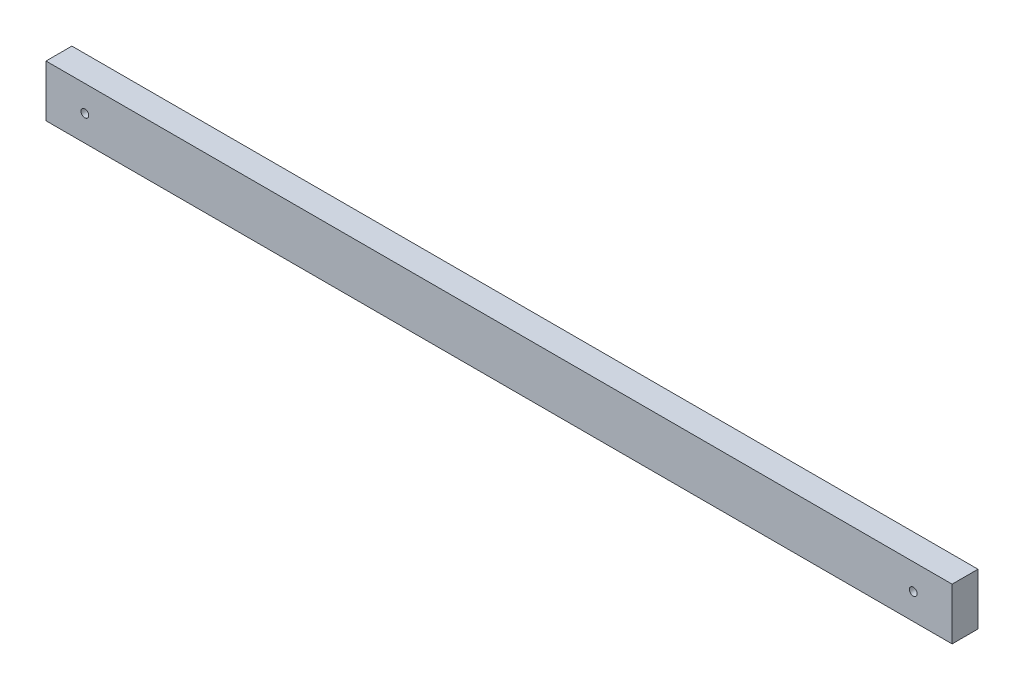
ISO-10303-21;
HEADER;
FILE_DESCRIPTION(('STEP AP214'),'2;1');
FILE_NAME('part.step','',(''),(''),'','','');
FILE_SCHEMA(('AUTOMOTIVE_DESIGN { 1 0 10303 214 1 1 1 1 }'));
ENDSEC;
DATA;
#1=APPLICATION_CONTEXT('core data for automotive mechanical design processes');
#2=APPLICATION_PROTOCOL_DEFINITION('international standard','automotive_design',2000,#1);
#3=PRODUCT_CONTEXT('',#1,'mechanical');
#4=PRODUCT('Part','Part','',(#3));
#5=PRODUCT_RELATED_PRODUCT_CATEGORY('part','',(#4));
#6=PRODUCT_DEFINITION_FORMATION('','',#4);
#7=PRODUCT_DEFINITION_CONTEXT('part definition',#1,'design');
#8=PRODUCT_DEFINITION('design','',#6,#7);
#9=PRODUCT_DEFINITION_SHAPE('','',#8);
#10=(LENGTH_UNIT() NAMED_UNIT(*) SI_UNIT(.MILLI.,.METRE.));
#11=(NAMED_UNIT(*) PLANE_ANGLE_UNIT() SI_UNIT($,.RADIAN.));
#12=(NAMED_UNIT(*) SI_UNIT($,.STERADIAN.) SOLID_ANGLE_UNIT());
#13=UNCERTAINTY_MEASURE_WITH_UNIT(LENGTH_MEASURE(1.E-05),#10,'distance_accuracy_value','');
#14=(GEOMETRIC_REPRESENTATION_CONTEXT(3) GLOBAL_UNCERTAINTY_ASSIGNED_CONTEXT((#13)) GLOBAL_UNIT_ASSIGNED_CONTEXT((#10,
#11,#12)) REPRESENTATION_CONTEXT('',''));
#15=CARTESIAN_POINT('',(0.,0.,0.));
#16=DIRECTION('',(0.,0.,1.));
#17=DIRECTION('',(1.,0.,0.));
#18=AXIS2_PLACEMENT_3D('',#15,#16,#17);
#19=CARTESIAN_POINT('',(-175.,-10.,10.));
#20=DIRECTION('',(1.,0.,0.));
#21=DIRECTION('',(0.,0.,-1.));
#22=AXIS2_PLACEMENT_3D('',#19,#20,#21);
#23=PLANE('',#22);
#24=DIRECTION('',(0.,-1.,0.));
#25=VECTOR('',#24,1.);
#26=CARTESIAN_POINT('',(-175.,-10.,0.));
#27=LINE('',#26,#25);
#28=CARTESIAN_POINT('',(-175.,9.99999999999998,0.));
#29=VERTEX_POINT('',#28);
#30=CARTESIAN_POINT('',(-175.,-10.,0.));
#31=VERTEX_POINT('',#30);
#32=EDGE_CURVE('E96',#29,#31,#27,.T.);
#33=ORIENTED_EDGE('',*,*,#32,.T.);
#34=DIRECTION('',(0.,0.,-1.));
#35=VECTOR('',#34,1.);
#36=CARTESIAN_POINT('',(-175.,-10.,10.));
#37=LINE('',#36,#35);
#38=CARTESIAN_POINT('',(-175.,-10.,10.));
#39=VERTEX_POINT('',#38);
#40=EDGE_CURVE('E11',#39,#31,#37,.T.);
#41=ORIENTED_EDGE('',*,*,#40,.F.);
#42=DIRECTION('',(0.,-1.,0.));
#43=VECTOR('',#42,1.);
#44=CARTESIAN_POINT('',(-175.,-10.,10.));
#45=LINE('',#44,#43);
#46=CARTESIAN_POINT('',(-175.,9.99999999999998,10.));
#47=VERTEX_POINT('',#46);
#48=EDGE_CURVE('E84',#47,#39,#45,.T.);
#49=ORIENTED_EDGE('',*,*,#48,.F.);
#50=DIRECTION('',(0.,0.,-1.));
#51=VECTOR('',#50,1.);
#52=CARTESIAN_POINT('',(-175.,9.99999999999998,10.));
#53=LINE('',#52,#51);
#54=EDGE_CURVE('E92',#47,#29,#53,.T.);
#55=ORIENTED_EDGE('',*,*,#54,.T.);
#56=EDGE_LOOP('',(#33,#41,#49,#55));
#57=FACE_BOUND('',#56,.T.);
#58=ADVANCED_FACE('F33',(#57),#23,.F.);
#59=CARTESIAN_POINT('',(175.,-9.99999999999998,10.));
#60=DIRECTION('',(0.,1.,0.));
#61=DIRECTION('',(-1.,0.,0.));
#62=AXIS2_PLACEMENT_3D('',#59,#60,#61);
#63=PLANE('',#62);
#64=DIRECTION('',(1.,0.,0.));
#65=VECTOR('',#64,1.);
#66=CARTESIAN_POINT('',(175.,-9.99999999999998,0.));
#67=LINE('',#66,#65);
#68=CARTESIAN_POINT('',(175.,-9.99999999999998,0.));
#69=VERTEX_POINT('',#68);
#70=EDGE_CURVE('E88',#31,#69,#67,.T.);
#71=ORIENTED_EDGE('',*,*,#70,.T.);
#72=DIRECTION('',(0.,0.,-1.));
#73=VECTOR('',#72,1.);
#74=CARTESIAN_POINT('',(175.,-9.99999999999998,10.));
#75=LINE('',#74,#73);
#76=CARTESIAN_POINT('',(175.,-9.99999999999998,10.));
#77=VERTEX_POINT('',#76);
#78=EDGE_CURVE('E41',#77,#69,#75,.T.);
#79=ORIENTED_EDGE('',*,*,#78,.F.);
#80=DIRECTION('',(1.,0.,0.));
#81=VECTOR('',#80,1.);
#82=CARTESIAN_POINT('',(175.,-9.99999999999998,10.));
#83=LINE('',#82,#81);
#84=EDGE_CURVE('E79',#39,#77,#83,.T.);
#85=ORIENTED_EDGE('',*,*,#84,.F.);
#86=ORIENTED_EDGE('',*,*,#40,.T.);
#87=EDGE_LOOP('',(#71,#79,#85,#86));
#88=FACE_BOUND('',#87,.T.);
#89=ADVANCED_FACE('F87',(#88),#63,.F.);
#90=CARTESIAN_POINT('',(175.,-9.99999999999998,10.));
#91=DIRECTION('',(-1.,0.,0.));
#92=DIRECTION('',(0.,0.,1.));
#93=AXIS2_PLACEMENT_3D('',#90,#91,#92);
#94=PLANE('',#93);
#95=DIRECTION('',(0.,1.,0.));
#96=VECTOR('',#95,1.);
#97=CARTESIAN_POINT('',(175.,-9.99999999999998,0.));
#98=LINE('',#97,#96);
#99=CARTESIAN_POINT('',(175.,10.,0.));
#100=VERTEX_POINT('',#99);
#101=EDGE_CURVE('E66',#69,#100,#98,.T.);
#102=ORIENTED_EDGE('',*,*,#101,.T.);
#103=DIRECTION('',(0.,0.,-1.));
#104=VECTOR('',#103,1.);
#105=CARTESIAN_POINT('',(175.,10.,10.));
#106=LINE('',#105,#104);
#107=CARTESIAN_POINT('',(175.,10.,10.));
#108=VERTEX_POINT('',#107);
#109=EDGE_CURVE('E89',#108,#100,#106,.T.);
#110=ORIENTED_EDGE('',*,*,#109,.F.);
#111=DIRECTION('',(0.,1.,0.));
#112=VECTOR('',#111,1.);
#113=CARTESIAN_POINT('',(175.,-9.99999999999998,10.));
#114=LINE('',#113,#112);
#115=EDGE_CURVE('E82',#77,#108,#114,.T.);
#116=ORIENTED_EDGE('',*,*,#115,.F.);
#117=ORIENTED_EDGE('',*,*,#78,.T.);
#118=EDGE_LOOP('',(#102,#110,#116,#117));
#119=FACE_BOUND('',#118,.T.);
#120=ADVANCED_FACE('F90',(#119),#94,.F.);
#121=CARTESIAN_POINT('',(175.,10.,10.));
#122=DIRECTION('',(0.,-1.,0.));
#123=DIRECTION('',(1.,0.,0.));
#124=AXIS2_PLACEMENT_3D('',#121,#122,#123);
#125=PLANE('',#124);
#126=DIRECTION('',(-1.,0.,0.));
#127=VECTOR('',#126,1.);
#128=CARTESIAN_POINT('',(175.,10.,0.));
#129=LINE('',#128,#127);
#130=EDGE_CURVE('E72',#100,#29,#129,.T.);
#131=ORIENTED_EDGE('',*,*,#130,.T.);
#132=ORIENTED_EDGE('',*,*,#54,.F.);
#133=DIRECTION('',(-1.,0.,0.));
#134=VECTOR('',#133,1.);
#135=CARTESIAN_POINT('',(175.,10.,10.));
#136=LINE('',#135,#134);
#137=EDGE_CURVE('E49',#108,#47,#136,.T.);
#138=ORIENTED_EDGE('',*,*,#137,.F.);
#139=ORIENTED_EDGE('',*,*,#109,.T.);
#140=EDGE_LOOP('',(#131,#132,#138,#139));
#141=FACE_BOUND('',#140,.T.);
#142=ADVANCED_FACE('F104',(#141),#125,.F.);
#143=CARTESIAN_POINT('',(0.,0.,10.));
#144=DIRECTION('',(0.,0.,1.));
#145=DIRECTION('',(1.,0.,0.));
#146=AXIS2_PLACEMENT_3D('',#143,#144,#145);
#147=PLANE('',#146);
#148=CARTESIAN_POINT('',(160.,-2.66453525910038E-12,10.));
#149=DIRECTION('',(0.,0.,1.));
#150=DIRECTION('',(-1.,0.,0.));
#151=AXIS2_PLACEMENT_3D('',#148,#149,#150);
#152=CIRCLE('',#151,1.5);
#153=CARTESIAN_POINT('',(158.5,-2.66453525910038E-12,10.));
#154=VERTEX_POINT('',#153);
#155=EDGE_CURVE('E116',#154,#154,#152,.T.);
#156=ORIENTED_EDGE('',*,*,#155,.F.);
#157=EDGE_LOOP('',(#156));
#158=FACE_BOUND('',#157,.T.);
#159=CARTESIAN_POINT('',(-160.,0.,10.));
#160=DIRECTION('',(0.,0.,1.));
#161=DIRECTION('',(1.,0.,0.));
#162=AXIS2_PLACEMENT_3D('',#159,#160,#161);
#163=CIRCLE('',#162,1.5);
#164=CARTESIAN_POINT('',(-158.5,0.,10.));
#165=VERTEX_POINT('',#164);
#166=EDGE_CURVE('E110',#165,#165,#163,.T.);
#167=ORIENTED_EDGE('',*,*,#166,.F.);
#168=EDGE_LOOP('',(#167));
#169=FACE_BOUND('',#168,.T.);
#170=ORIENTED_EDGE('',*,*,#48,.T.);
#171=ORIENTED_EDGE('',*,*,#84,.T.);
#172=ORIENTED_EDGE('',*,*,#115,.T.);
#173=ORIENTED_EDGE('',*,*,#137,.T.);
#174=EDGE_LOOP('',(#170,#171,#172,#173));
#175=FACE_BOUND('',#174,.T.);
#176=ADVANCED_FACE('F80',(#158,#169,#175),#147,.T.);
#177=CARTESIAN_POINT('',(0.,0.,0.));
#178=DIRECTION('',(0.,0.,1.));
#179=DIRECTION('',(1.,0.,0.));
#180=AXIS2_PLACEMENT_3D('',#177,#178,#179);
#181=PLANE('',#180);
#182=CARTESIAN_POINT('',(160.,-2.66453525910038E-12,0.));
#183=DIRECTION('',(0.,0.,1.));
#184=DIRECTION('',(-1.,0.,0.));
#185=AXIS2_PLACEMENT_3D('',#182,#183,#184);
#186=CIRCLE('',#185,1.5);
#187=CARTESIAN_POINT('',(158.5,-2.66453525910038E-12,0.));
#188=VERTEX_POINT('',#187);
#189=EDGE_CURVE('E113',#188,#188,#186,.T.);
#190=ORIENTED_EDGE('',*,*,#189,.T.);
#191=EDGE_LOOP('',(#190));
#192=FACE_BOUND('',#191,.T.);
#193=CARTESIAN_POINT('',(-160.,0.,0.));
#194=DIRECTION('',(0.,0.,1.));
#195=DIRECTION('',(1.,0.,0.));
#196=AXIS2_PLACEMENT_3D('',#193,#194,#195);
#197=CIRCLE('',#196,1.5);
#198=CARTESIAN_POINT('',(-158.5,0.,0.));
#199=VERTEX_POINT('',#198);
#200=EDGE_CURVE('E99',#199,#199,#197,.T.);
#201=ORIENTED_EDGE('',*,*,#200,.T.);
#202=EDGE_LOOP('',(#201));
#203=FACE_BOUND('',#202,.T.);
#204=ORIENTED_EDGE('',*,*,#32,.F.);
#205=ORIENTED_EDGE('',*,*,#130,.F.);
#206=ORIENTED_EDGE('',*,*,#101,.F.);
#207=ORIENTED_EDGE('',*,*,#70,.F.);
#208=EDGE_LOOP('',(#204,#205,#206,#207));
#209=FACE_BOUND('',#208,.T.);
#210=ADVANCED_FACE('F107',(#192,#203,#209),#181,.F.);
#211=CARTESIAN_POINT('',(-160.,0.,0.));
#212=DIRECTION('',(0.,0.,1.));
#213=DIRECTION('',(1.,0.,0.));
#214=AXIS2_PLACEMENT_3D('',#211,#212,#213);
#215=CYLINDRICAL_SURFACE('',#214,1.5);
#216=ORIENTED_EDGE('',*,*,#200,.F.);
#217=EDGE_LOOP('',(#216));
#218=FACE_BOUND('',#217,.T.);
#219=ORIENTED_EDGE('',*,*,#166,.T.);
#220=EDGE_LOOP('',(#219));
#221=FACE_BOUND('',#220,.T.);
#222=ADVANCED_FACE('F127',(#218,#221),#215,.F.);
#223=CARTESIAN_POINT('',(160.,-2.66453525910038E-12,0.));
#224=DIRECTION('',(0.,0.,1.));
#225=DIRECTION('',(1.,0.,0.));
#226=AXIS2_PLACEMENT_3D('',#223,#224,#225);
#227=CYLINDRICAL_SURFACE('',#226,1.5);
#228=ORIENTED_EDGE('',*,*,#189,.F.);
#229=EDGE_LOOP('',(#228));
#230=FACE_BOUND('',#229,.T.);
#231=ORIENTED_EDGE('',*,*,#155,.T.);
#232=EDGE_LOOP('',(#231));
#233=FACE_BOUND('',#232,.T.);
#234=ADVANCED_FACE('F124',(#230,#233),#227,.F.);
#235=CLOSED_SHELL('',(#58,#89,#120,#142,#176,#210,#222,#234));
#236=MANIFOLD_SOLID_BREP('B2',#235);
#237=ADVANCED_BREP_SHAPE_REPRESENTATION('',(#18,#236),#14);
#238=SHAPE_DEFINITION_REPRESENTATION(#9,#237);
ENDSEC;
END-ISO-10303-21;
